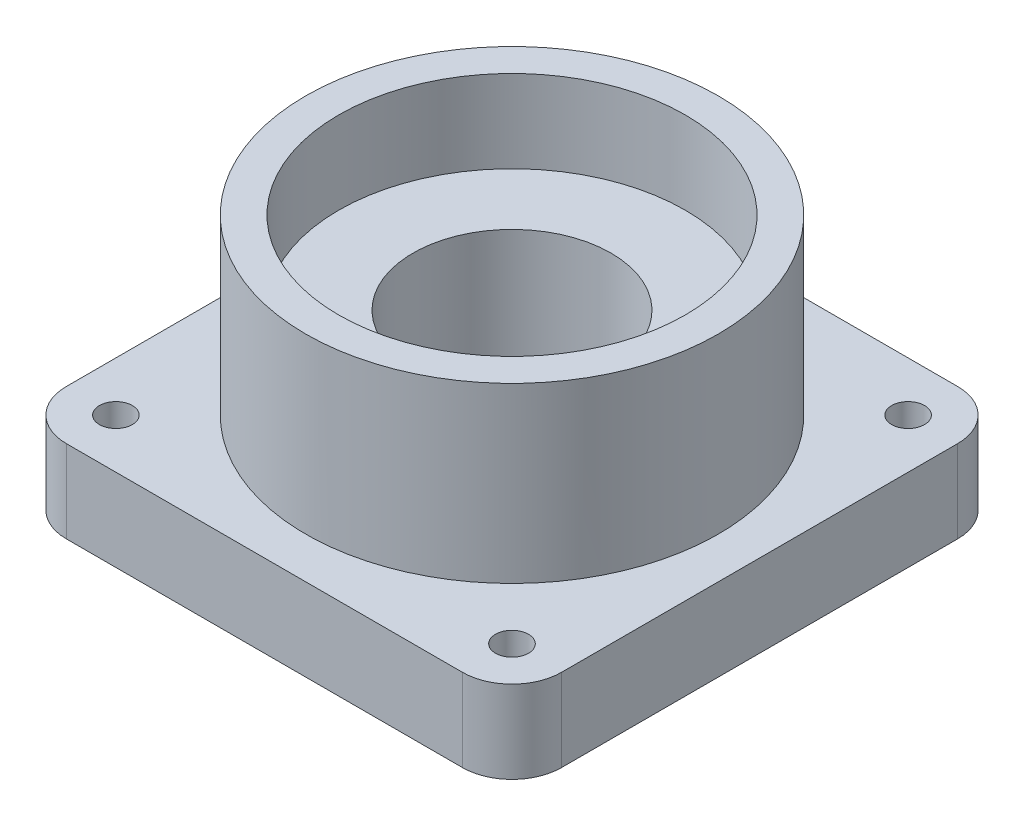
ISO-10303-21;
HEADER;
FILE_DESCRIPTION(('STEP AP214'),'2;1');
FILE_NAME('part.step','',(''),(''),'','','');
FILE_SCHEMA(('AUTOMOTIVE_DESIGN { 1 0 10303 214 1 1 1 1 }'));
ENDSEC;
DATA;
#1=APPLICATION_CONTEXT('core data for automotive mechanical design processes');
#2=APPLICATION_PROTOCOL_DEFINITION('international standard','automotive_design',2000,#1);
#3=PRODUCT_CONTEXT('',#1,'mechanical');
#4=PRODUCT('Part','Part','',(#3));
#5=PRODUCT_RELATED_PRODUCT_CATEGORY('part','',(#4));
#6=PRODUCT_DEFINITION_FORMATION('','',#4);
#7=PRODUCT_DEFINITION_CONTEXT('part definition',#1,'design');
#8=PRODUCT_DEFINITION('design','',#6,#7);
#9=PRODUCT_DEFINITION_SHAPE('','',#8);
#10=(LENGTH_UNIT() NAMED_UNIT(*) SI_UNIT(.MILLI.,.METRE.));
#11=(NAMED_UNIT(*) PLANE_ANGLE_UNIT() SI_UNIT($,.RADIAN.));
#12=(NAMED_UNIT(*) SI_UNIT($,.STERADIAN.) SOLID_ANGLE_UNIT());
#13=UNCERTAINTY_MEASURE_WITH_UNIT(LENGTH_MEASURE(1.E-05),#10,'distance_accuracy_value','');
#14=(GEOMETRIC_REPRESENTATION_CONTEXT(3) GLOBAL_UNCERTAINTY_ASSIGNED_CONTEXT((#13)) GLOBAL_UNIT_ASSIGNED_CONTEXT((#10,
#11,#12)) REPRESENTATION_CONTEXT('',''));
#15=CARTESIAN_POINT('',(0.,0.,0.));
#16=DIRECTION('',(0.,0.,1.));
#17=DIRECTION('',(1.,0.,0.));
#18=AXIS2_PLACEMENT_3D('',#15,#16,#17);
#19=CARTESIAN_POINT('',(15.,5.,15.));
#20=DIRECTION('',(-1.,0.,0.));
#21=DIRECTION('',(0.,0.,1.));
#22=AXIS2_PLACEMENT_3D('',#19,#20,#21);
#23=PLANE('',#22);
#24=DIRECTION('',(0.,0.,-1.));
#25=VECTOR('',#24,1.);
#26=CARTESIAN_POINT('',(15.,0.,15.));
#27=LINE('',#26,#25);
#28=CARTESIAN_POINT('',(15.,0.,12.));
#29=VERTEX_POINT('',#28);
#30=CARTESIAN_POINT('',(15.,0.,-12.));
#31=VERTEX_POINT('',#30);
#32=EDGE_CURVE('E135',#29,#31,#27,.T.);
#33=ORIENTED_EDGE('',*,*,#32,.T.);
#34=DIRECTION('',(0.,-1.,0.));
#35=VECTOR('',#34,1.);
#36=CARTESIAN_POINT('',(15.,5.,-12.));
#37=LINE('',#36,#35);
#38=CARTESIAN_POINT('',(15.,5.,-12.));
#39=VERTEX_POINT('',#38);
#40=EDGE_CURVE('E158',#31,#39,#37,.F.);
#41=ORIENTED_EDGE('',*,*,#40,.T.);
#42=DIRECTION('',(0.,0.,-1.));
#43=VECTOR('',#42,1.);
#44=CARTESIAN_POINT('',(15.,5.,15.));
#45=LINE('',#44,#43);
#46=CARTESIAN_POINT('',(15.,5.,12.));
#47=VERTEX_POINT('',#46);
#48=EDGE_CURVE('E133',#47,#39,#45,.T.);
#49=ORIENTED_EDGE('',*,*,#48,.F.);
#50=DIRECTION('',(0.,-1.,0.));
#51=VECTOR('',#50,1.);
#52=CARTESIAN_POINT('',(15.,5.,12.));
#53=LINE('',#52,#51);
#54=EDGE_CURVE('E155',#47,#29,#53,.T.);
#55=ORIENTED_EDGE('',*,*,#54,.T.);
#56=EDGE_LOOP('',(#33,#41,#49,#55));
#57=FACE_BOUND('',#56,.T.);
#58=ADVANCED_FACE('F38',(#57),#23,.F.);
#59=CARTESIAN_POINT('',(-15.,5.,-15.));
#60=DIRECTION('',(0.,0.,1.));
#61=DIRECTION('',(1.,0.,0.));
#62=AXIS2_PLACEMENT_3D('',#59,#60,#61);
#63=PLANE('',#62);
#64=DIRECTION('',(-1.,0.,0.));
#65=VECTOR('',#64,1.);
#66=CARTESIAN_POINT('',(-15.,0.,-15.));
#67=LINE('',#66,#65);
#68=CARTESIAN_POINT('',(12.,0.,-15.));
#69=VERTEX_POINT('',#68);
#70=CARTESIAN_POINT('',(-12.,0.,-15.));
#71=VERTEX_POINT('',#70);
#72=EDGE_CURVE('E131',#69,#71,#67,.T.);
#73=ORIENTED_EDGE('',*,*,#72,.T.);
#74=DIRECTION('',(0.,-1.,0.));
#75=VECTOR('',#74,1.);
#76=CARTESIAN_POINT('',(-12.,5.,-15.));
#77=LINE('',#76,#75);
#78=CARTESIAN_POINT('',(-12.,5.,-15.));
#79=VERTEX_POINT('',#78);
#80=EDGE_CURVE('E110',#71,#79,#77,.F.);
#81=ORIENTED_EDGE('',*,*,#80,.T.);
#82=DIRECTION('',(-1.,0.,0.));
#83=VECTOR('',#82,1.);
#84=CARTESIAN_POINT('',(-15.,5.,-15.));
#85=LINE('',#84,#83);
#86=CARTESIAN_POINT('',(12.,5.,-15.));
#87=VERTEX_POINT('',#86);
#88=EDGE_CURVE('E191',#87,#79,#85,.T.);
#89=ORIENTED_EDGE('',*,*,#88,.F.);
#90=DIRECTION('',(0.,-1.,0.));
#91=VECTOR('',#90,1.);
#92=CARTESIAN_POINT('',(12.,5.,-15.));
#93=LINE('',#92,#91);
#94=EDGE_CURVE('E115',#87,#69,#93,.T.);
#95=ORIENTED_EDGE('',*,*,#94,.T.);
#96=EDGE_LOOP('',(#73,#81,#89,#95));
#97=FACE_BOUND('',#96,.T.);
#98=ADVANCED_FACE('F255',(#97),#63,.F.);
#99=CARTESIAN_POINT('',(-15.,5.,15.));
#100=DIRECTION('',(1.,0.,0.));
#101=DIRECTION('',(0.,0.,-1.));
#102=AXIS2_PLACEMENT_3D('',#99,#100,#101);
#103=PLANE('',#102);
#104=DIRECTION('',(0.,0.,1.));
#105=VECTOR('',#104,1.);
#106=CARTESIAN_POINT('',(-15.,5.,15.));
#107=LINE('',#106,#105);
#108=CARTESIAN_POINT('',(-15.,5.,-12.));
#109=VERTEX_POINT('',#108);
#110=CARTESIAN_POINT('',(-15.,5.,12.));
#111=VERTEX_POINT('',#110);
#112=EDGE_CURVE('E124',#109,#111,#107,.T.);
#113=ORIENTED_EDGE('',*,*,#112,.F.);
#114=DIRECTION('',(0.,-1.,0.));
#115=VECTOR('',#114,1.);
#116=CARTESIAN_POINT('',(-15.,5.,-12.));
#117=LINE('',#116,#115);
#118=CARTESIAN_POINT('',(-15.,0.,-12.));
#119=VERTEX_POINT('',#118);
#120=EDGE_CURVE('E109',#109,#119,#117,.T.);
#121=ORIENTED_EDGE('',*,*,#120,.T.);
#122=DIRECTION('',(0.,0.,1.));
#123=VECTOR('',#122,1.);
#124=CARTESIAN_POINT('',(-15.,0.,15.));
#125=LINE('',#124,#123);
#126=CARTESIAN_POINT('',(-15.,0.,12.));
#127=VERTEX_POINT('',#126);
#128=EDGE_CURVE('E122',#119,#127,#125,.T.);
#129=ORIENTED_EDGE('',*,*,#128,.T.);
#130=DIRECTION('',(0.,-1.,0.));
#131=VECTOR('',#130,1.);
#132=CARTESIAN_POINT('',(-15.,5.,12.));
#133=LINE('',#132,#131);
#134=EDGE_CURVE('E126',#127,#111,#133,.F.);
#135=ORIENTED_EDGE('',*,*,#134,.T.);
#136=EDGE_LOOP('',(#113,#121,#129,#135));
#137=FACE_BOUND('',#136,.T.);
#138=ADVANCED_FACE('F121',(#137),#103,.F.);
#139=CARTESIAN_POINT('',(-15.,5.,15.));
#140=DIRECTION('',(0.,0.,-1.));
#141=DIRECTION('',(-1.,0.,0.));
#142=AXIS2_PLACEMENT_3D('',#139,#140,#141);
#143=PLANE('',#142);
#144=DIRECTION('',(1.,0.,0.));
#145=VECTOR('',#144,1.);
#146=CARTESIAN_POINT('',(-15.,0.,15.));
#147=LINE('',#146,#145);
#148=CARTESIAN_POINT('',(-12.,0.,15.));
#149=VERTEX_POINT('',#148);
#150=CARTESIAN_POINT('',(12.,0.,15.));
#151=VERTEX_POINT('',#150);
#152=EDGE_CURVE('E130',#149,#151,#147,.T.);
#153=ORIENTED_EDGE('',*,*,#152,.T.);
#154=DIRECTION('',(0.,-1.,0.));
#155=VECTOR('',#154,1.);
#156=CARTESIAN_POINT('',(12.,5.,15.));
#157=LINE('',#156,#155);
#158=CARTESIAN_POINT('',(12.,5.,15.));
#159=VERTEX_POINT('',#158);
#160=EDGE_CURVE('E53',#151,#159,#157,.F.);
#161=ORIENTED_EDGE('',*,*,#160,.T.);
#162=DIRECTION('',(1.,0.,0.));
#163=VECTOR('',#162,1.);
#164=CARTESIAN_POINT('',(-15.,5.,15.));
#165=LINE('',#164,#163);
#166=CARTESIAN_POINT('',(-12.,5.,15.));
#167=VERTEX_POINT('',#166);
#168=EDGE_CURVE('E139',#167,#159,#165,.T.);
#169=ORIENTED_EDGE('',*,*,#168,.F.);
#170=DIRECTION('',(0.,-1.,0.));
#171=VECTOR('',#170,1.);
#172=CARTESIAN_POINT('',(-12.,5.,15.));
#173=LINE('',#172,#171);
#174=EDGE_CURVE('E160',#167,#149,#173,.T.);
#175=ORIENTED_EDGE('',*,*,#174,.T.);
#176=EDGE_LOOP('',(#153,#161,#169,#175));
#177=FACE_BOUND('',#176,.T.);
#178=ADVANCED_FACE('F172',(#177),#143,.F.);
#179=CARTESIAN_POINT('',(0.,5.,0.));
#180=DIRECTION('',(0.,-1.,0.));
#181=DIRECTION('',(0.,0.,-1.));
#182=AXIS2_PLACEMENT_3D('',#179,#180,#181);
#183=PLANE('',#182);
#184=CARTESIAN_POINT('',(0.,5.,0.));
#185=DIRECTION('',(0.,-1.,0.));
#186=DIRECTION('',(0.,0.,-1.));
#187=AXIS2_PLACEMENT_3D('',#184,#185,#186);
#188=CIRCLE('',#187,12.5);
#189=CARTESIAN_POINT('',(0.,5.,-12.5));
#190=VERTEX_POINT('',#189);
#191=EDGE_CURVE('E46',#190,#190,#188,.F.);
#192=ORIENTED_EDGE('',*,*,#191,.F.);
#193=EDGE_LOOP('',(#192));
#194=FACE_BOUND('',#193,.T.);
#195=CARTESIAN_POINT('',(12.,5.,-12.));
#196=DIRECTION('',(0.,1.,0.));
#197=DIRECTION('',(0.,0.,1.));
#198=AXIS2_PLACEMENT_3D('',#195,#196,#197);
#199=CIRCLE('',#198,1.);
#200=CARTESIAN_POINT('',(12.,5.,-11.));
#201=VERTEX_POINT('',#200);
#202=EDGE_CURVE('E177',#201,#201,#199,.T.);
#203=ORIENTED_EDGE('',*,*,#202,.F.);
#204=EDGE_LOOP('',(#203));
#205=FACE_BOUND('',#204,.T.);
#206=CARTESIAN_POINT('',(-12.,5.,12.));
#207=DIRECTION('',(0.,1.,0.));
#208=DIRECTION('',(0.,0.,1.));
#209=AXIS2_PLACEMENT_3D('',#206,#207,#208);
#210=CIRCLE('',#209,1.);
#211=CARTESIAN_POINT('',(-12.,5.,13.));
#212=VERTEX_POINT('',#211);
#213=EDGE_CURVE('E181',#212,#212,#210,.T.);
#214=ORIENTED_EDGE('',*,*,#213,.F.);
#215=EDGE_LOOP('',(#214));
#216=FACE_BOUND('',#215,.T.);
#217=CARTESIAN_POINT('',(12.,5.,12.));
#218=DIRECTION('',(0.,1.,0.));
#219=DIRECTION('',(0.,0.,1.));
#220=AXIS2_PLACEMENT_3D('',#217,#218,#219);
#221=CIRCLE('',#220,0.999999999999999);
#222=CARTESIAN_POINT('',(12.,5.,13.));
#223=VERTEX_POINT('',#222);
#224=EDGE_CURVE('E185',#223,#223,#221,.T.);
#225=ORIENTED_EDGE('',*,*,#224,.F.);
#226=EDGE_LOOP('',(#225));
#227=FACE_BOUND('',#226,.T.);
#228=CARTESIAN_POINT('',(-12.,5.,-12.));
#229=DIRECTION('',(0.,1.,0.));
#230=DIRECTION('',(0.,0.,1.));
#231=AXIS2_PLACEMENT_3D('',#228,#229,#230);
#232=CIRCLE('',#231,1.);
#233=CARTESIAN_POINT('',(-12.,5.,-11.));
#234=VERTEX_POINT('',#233);
#235=EDGE_CURVE('E188',#234,#234,#232,.T.);
#236=ORIENTED_EDGE('',*,*,#235,.F.);
#237=EDGE_LOOP('',(#236));
#238=FACE_BOUND('',#237,.T.);
#239=ORIENTED_EDGE('',*,*,#88,.T.);
#240=CARTESIAN_POINT('',(-12.,5.,-12.));
#241=DIRECTION('',(0.,-1.,0.));
#242=DIRECTION('',(0.,0.,-1.));
#243=AXIS2_PLACEMENT_3D('',#240,#241,#242);
#244=CIRCLE('',#243,3.);
#245=EDGE_CURVE('E153',#79,#109,#244,.F.);
#246=ORIENTED_EDGE('',*,*,#245,.T.);
#247=ORIENTED_EDGE('',*,*,#112,.T.);
#248=CARTESIAN_POINT('',(-12.,5.,12.));
#249=DIRECTION('',(0.,-1.,0.));
#250=DIRECTION('',(0.,0.,-1.));
#251=AXIS2_PLACEMENT_3D('',#248,#249,#250);
#252=CIRCLE('',#251,3.);
#253=EDGE_CURVE('E60',#111,#167,#252,.F.);
#254=ORIENTED_EDGE('',*,*,#253,.T.);
#255=ORIENTED_EDGE('',*,*,#168,.T.);
#256=CARTESIAN_POINT('',(12.,5.,12.));
#257=DIRECTION('',(0.,-1.,0.));
#258=DIRECTION('',(0.,0.,-1.));
#259=AXIS2_PLACEMENT_3D('',#256,#257,#258);
#260=CIRCLE('',#259,3.);
#261=EDGE_CURVE('E149',#159,#47,#260,.F.);
#262=ORIENTED_EDGE('',*,*,#261,.T.);
#263=ORIENTED_EDGE('',*,*,#48,.T.);
#264=CARTESIAN_POINT('',(12.,5.,-12.));
#265=DIRECTION('',(0.,-1.,0.));
#266=DIRECTION('',(0.,0.,-1.));
#267=AXIS2_PLACEMENT_3D('',#264,#265,#266);
#268=CIRCLE('',#267,3.);
#269=EDGE_CURVE('E151',#39,#87,#268,.F.);
#270=ORIENTED_EDGE('',*,*,#269,.T.);
#271=EDGE_LOOP('',(#239,#246,#247,#254,#255,#262,#263,#270));
#272=FACE_BOUND('',#271,.T.);
#273=ADVANCED_FACE('F169',(#194,#205,#216,#227,#238,#272),#183,.F.);
#274=CARTESIAN_POINT('',(0.,0.,0.));
#275=DIRECTION('',(0.,-1.,0.));
#276=DIRECTION('',(0.,0.,-1.));
#277=AXIS2_PLACEMENT_3D('',#274,#275,#276);
#278=PLANE('',#277);
#279=CARTESIAN_POINT('',(0.,0.,0.));
#280=DIRECTION('',(0.,-1.,0.));
#281=DIRECTION('',(0.,0.,-1.));
#282=AXIS2_PLACEMENT_3D('',#279,#280,#281);
#283=CIRCLE('',#282,6.);
#284=CARTESIAN_POINT('',(0.,0.,-6.));
#285=VERTEX_POINT('',#284);
#286=EDGE_CURVE('E229',#285,#285,#283,.F.);
#287=ORIENTED_EDGE('',*,*,#286,.T.);
#288=EDGE_LOOP('',(#287));
#289=FACE_BOUND('',#288,.T.);
#290=CARTESIAN_POINT('',(12.,0.,-12.));
#291=DIRECTION('',(0.,-1.,0.));
#292=DIRECTION('',(0.,0.,-1.));
#293=AXIS2_PLACEMENT_3D('',#290,#291,#292);
#294=CIRCLE('',#293,1.);
#295=CARTESIAN_POINT('',(12.,0.,-13.));
#296=VERTEX_POINT('',#295);
#297=EDGE_CURVE('E209',#296,#296,#294,.F.);
#298=ORIENTED_EDGE('',*,*,#297,.T.);
#299=EDGE_LOOP('',(#298));
#300=FACE_BOUND('',#299,.T.);
#301=CARTESIAN_POINT('',(-12.,0.,12.));
#302=DIRECTION('',(0.,-1.,0.));
#303=DIRECTION('',(0.,0.,-1.));
#304=AXIS2_PLACEMENT_3D('',#301,#302,#303);
#305=CIRCLE('',#304,1.);
#306=CARTESIAN_POINT('',(-12.,0.,11.));
#307=VERTEX_POINT('',#306);
#308=EDGE_CURVE('E212',#307,#307,#305,.F.);
#309=ORIENTED_EDGE('',*,*,#308,.T.);
#310=EDGE_LOOP('',(#309));
#311=FACE_BOUND('',#310,.T.);
#312=CARTESIAN_POINT('',(12.,0.,12.));
#313=DIRECTION('',(0.,-1.,0.));
#314=DIRECTION('',(0.,0.,-1.));
#315=AXIS2_PLACEMENT_3D('',#312,#313,#314);
#316=CIRCLE('',#315,0.999999999999999);
#317=CARTESIAN_POINT('',(12.,0.,11.));
#318=VERTEX_POINT('',#317);
#319=EDGE_CURVE('E213',#318,#318,#316,.F.);
#320=ORIENTED_EDGE('',*,*,#319,.T.);
#321=EDGE_LOOP('',(#320));
#322=FACE_BOUND('',#321,.T.);
#323=CARTESIAN_POINT('',(-12.,0.,-12.));
#324=DIRECTION('',(0.,-1.,0.));
#325=DIRECTION('',(0.,0.,-1.));
#326=AXIS2_PLACEMENT_3D('',#323,#324,#325);
#327=CIRCLE('',#326,1.);
#328=CARTESIAN_POINT('',(-12.,0.,-13.));
#329=VERTEX_POINT('',#328);
#330=EDGE_CURVE('E205',#329,#329,#327,.F.);
#331=ORIENTED_EDGE('',*,*,#330,.T.);
#332=EDGE_LOOP('',(#331));
#333=FACE_BOUND('',#332,.T.);
#334=ORIENTED_EDGE('',*,*,#128,.F.);
#335=CARTESIAN_POINT('',(-12.,0.,-12.));
#336=DIRECTION('',(0.,-1.,0.));
#337=DIRECTION('',(0.,0.,-1.));
#338=AXIS2_PLACEMENT_3D('',#335,#336,#337);
#339=CIRCLE('',#338,3.);
#340=EDGE_CURVE('E105',#119,#71,#339,.T.);
#341=ORIENTED_EDGE('',*,*,#340,.T.);
#342=ORIENTED_EDGE('',*,*,#72,.F.);
#343=CARTESIAN_POINT('',(12.,0.,-12.));
#344=DIRECTION('',(0.,-1.,0.));
#345=DIRECTION('',(0.,0.,-1.));
#346=AXIS2_PLACEMENT_3D('',#343,#344,#345);
#347=CIRCLE('',#346,3.);
#348=EDGE_CURVE('E116',#69,#31,#347,.T.);
#349=ORIENTED_EDGE('',*,*,#348,.T.);
#350=ORIENTED_EDGE('',*,*,#32,.F.);
#351=CARTESIAN_POINT('',(12.,0.,12.));
#352=DIRECTION('',(0.,-1.,0.));
#353=DIRECTION('',(0.,0.,-1.));
#354=AXIS2_PLACEMENT_3D('',#351,#352,#353);
#355=CIRCLE('',#354,3.);
#356=EDGE_CURVE('E142',#29,#151,#355,.T.);
#357=ORIENTED_EDGE('',*,*,#356,.T.);
#358=ORIENTED_EDGE('',*,*,#152,.F.);
#359=CARTESIAN_POINT('',(-12.,0.,12.));
#360=DIRECTION('',(0.,-1.,0.));
#361=DIRECTION('',(0.,0.,-1.));
#362=AXIS2_PLACEMENT_3D('',#359,#360,#361);
#363=CIRCLE('',#362,3.);
#364=EDGE_CURVE('E125',#149,#127,#363,.T.);
#365=ORIENTED_EDGE('',*,*,#364,.T.);
#366=EDGE_LOOP('',(#334,#341,#342,#349,#350,#357,#358,#365));
#367=FACE_BOUND('',#366,.T.);
#368=ADVANCED_FACE('F128',(#289,#300,#311,#322,#333,#367),#278,.T.);
#369=CARTESIAN_POINT('',(-12.,-0.00100000000000013,-12.));
#370=DIRECTION('',(0.,1.,0.));
#371=DIRECTION('',(0.,0.,1.));
#372=AXIS2_PLACEMENT_3D('',#369,#370,#371);
#373=CYLINDRICAL_SURFACE('',#372,1.);
#374=ORIENTED_EDGE('',*,*,#330,.F.);
#375=EDGE_LOOP('',(#374));
#376=FACE_BOUND('',#375,.T.);
#377=ORIENTED_EDGE('',*,*,#235,.T.);
#378=EDGE_LOOP('',(#377));
#379=FACE_BOUND('',#378,.T.);
#380=ADVANCED_FACE('F287',(#376,#379),#373,.F.);
#381=CARTESIAN_POINT('',(12.,-0.00100000000000013,12.));
#382=DIRECTION('',(0.,1.,0.));
#383=DIRECTION('',(0.,0.,1.));
#384=AXIS2_PLACEMENT_3D('',#381,#382,#383);
#385=CYLINDRICAL_SURFACE('',#384,0.999999999999999);
#386=ORIENTED_EDGE('',*,*,#319,.F.);
#387=EDGE_LOOP('',(#386));
#388=FACE_BOUND('',#387,.T.);
#389=ORIENTED_EDGE('',*,*,#224,.T.);
#390=EDGE_LOOP('',(#389));
#391=FACE_BOUND('',#390,.T.);
#392=ADVANCED_FACE('F292',(#388,#391),#385,.F.);
#393=CARTESIAN_POINT('',(-12.,-0.00100000000000013,12.));
#394=DIRECTION('',(0.,1.,0.));
#395=DIRECTION('',(0.,0.,1.));
#396=AXIS2_PLACEMENT_3D('',#393,#394,#395);
#397=CYLINDRICAL_SURFACE('',#396,1.);
#398=ORIENTED_EDGE('',*,*,#308,.F.);
#399=EDGE_LOOP('',(#398));
#400=FACE_BOUND('',#399,.T.);
#401=ORIENTED_EDGE('',*,*,#213,.T.);
#402=EDGE_LOOP('',(#401));
#403=FACE_BOUND('',#402,.T.);
#404=ADVANCED_FACE('F294',(#400,#403),#397,.F.);
#405=CARTESIAN_POINT('',(12.,-0.00100000000000013,-12.));
#406=DIRECTION('',(0.,1.,0.));
#407=DIRECTION('',(0.,0.,1.));
#408=AXIS2_PLACEMENT_3D('',#405,#406,#407);
#409=CYLINDRICAL_SURFACE('',#408,1.);
#410=ORIENTED_EDGE('',*,*,#297,.F.);
#411=EDGE_LOOP('',(#410));
#412=FACE_BOUND('',#411,.T.);
#413=ORIENTED_EDGE('',*,*,#202,.T.);
#414=EDGE_LOOP('',(#413));
#415=FACE_BOUND('',#414,.T.);
#416=ADVANCED_FACE('F266',(#412,#415),#409,.F.);
#417=CARTESIAN_POINT('',(-12.,5.,-12.));
#418=DIRECTION('',(0.,-1.,0.));
#419=DIRECTION('',(0.,0.,-1.));
#420=AXIS2_PLACEMENT_3D('',#417,#418,#419);
#421=CYLINDRICAL_SURFACE('',#420,3.);
#422=ORIENTED_EDGE('',*,*,#245,.F.);
#423=ORIENTED_EDGE('',*,*,#80,.F.);
#424=ORIENTED_EDGE('',*,*,#340,.F.);
#425=ORIENTED_EDGE('',*,*,#120,.F.);
#426=EDGE_LOOP('',(#422,#423,#424,#425));
#427=FACE_BOUND('',#426,.T.);
#428=ADVANCED_FACE('F108',(#427),#421,.T.);
#429=CARTESIAN_POINT('',(12.,5.,-12.));
#430=DIRECTION('',(0.,-1.,0.));
#431=DIRECTION('',(0.,0.,-1.));
#432=AXIS2_PLACEMENT_3D('',#429,#430,#431);
#433=CYLINDRICAL_SURFACE('',#432,3.);
#434=ORIENTED_EDGE('',*,*,#269,.F.);
#435=ORIENTED_EDGE('',*,*,#40,.F.);
#436=ORIENTED_EDGE('',*,*,#348,.F.);
#437=ORIENTED_EDGE('',*,*,#94,.F.);
#438=EDGE_LOOP('',(#434,#435,#436,#437));
#439=FACE_BOUND('',#438,.T.);
#440=ADVANCED_FACE('F265',(#439),#433,.T.);
#441=CARTESIAN_POINT('',(12.,5.,12.));
#442=DIRECTION('',(0.,-1.,0.));
#443=DIRECTION('',(0.,0.,-1.));
#444=AXIS2_PLACEMENT_3D('',#441,#442,#443);
#445=CYLINDRICAL_SURFACE('',#444,3.);
#446=ORIENTED_EDGE('',*,*,#261,.F.);
#447=ORIENTED_EDGE('',*,*,#160,.F.);
#448=ORIENTED_EDGE('',*,*,#356,.F.);
#449=ORIENTED_EDGE('',*,*,#54,.F.);
#450=EDGE_LOOP('',(#446,#447,#448,#449));
#451=FACE_BOUND('',#450,.T.);
#452=ADVANCED_FACE('F268',(#451),#445,.T.);
#453=CARTESIAN_POINT('',(-12.,5.,12.));
#454=DIRECTION('',(0.,-1.,0.));
#455=DIRECTION('',(0.,0.,-1.));
#456=AXIS2_PLACEMENT_3D('',#453,#454,#455);
#457=CYLINDRICAL_SURFACE('',#456,3.);
#458=ORIENTED_EDGE('',*,*,#253,.F.);
#459=ORIENTED_EDGE('',*,*,#134,.F.);
#460=ORIENTED_EDGE('',*,*,#364,.F.);
#461=ORIENTED_EDGE('',*,*,#174,.F.);
#462=EDGE_LOOP('',(#458,#459,#460,#461));
#463=FACE_BOUND('',#462,.T.);
#464=ADVANCED_FACE('F40',(#463),#457,.T.);
#465=CARTESIAN_POINT('',(0.,10.5,0.));
#466=DIRECTION('',(0.,-1.,0.));
#467=DIRECTION('',(0.,0.,-1.));
#468=AXIS2_PLACEMENT_3D('',#465,#466,#467);
#469=CYLINDRICAL_SURFACE('',#468,12.5);
#470=ORIENTED_EDGE('',*,*,#191,.T.);
#471=EDGE_LOOP('',(#470));
#472=FACE_BOUND('',#471,.T.);
#473=CARTESIAN_POINT('',(0.,15.5,0.));
#474=DIRECTION('',(0.,1.,0.));
#475=DIRECTION('',(0.,0.,1.));
#476=AXIS2_PLACEMENT_3D('',#473,#474,#475);
#477=CIRCLE('',#476,12.5);
#478=CARTESIAN_POINT('',(0.,15.5,12.5));
#479=VERTEX_POINT('',#478);
#480=EDGE_CURVE('E220',#479,#479,#477,.T.);
#481=ORIENTED_EDGE('',*,*,#480,.F.);
#482=EDGE_LOOP('',(#481));
#483=FACE_BOUND('',#482,.T.);
#484=ADVANCED_FACE('F166',(#472,#483),#469,.T.);
#485=CARTESIAN_POINT('',(0.,15.5,0.));
#486=DIRECTION('',(0.,1.,0.));
#487=DIRECTION('',(0.,0.,1.));
#488=AXIS2_PLACEMENT_3D('',#485,#486,#487);
#489=PLANE('',#488);
#490=ORIENTED_EDGE('',*,*,#480,.T.);
#491=EDGE_LOOP('',(#490));
#492=FACE_BOUND('',#491,.T.);
#493=CARTESIAN_POINT('',(0.,15.5,0.));
#494=DIRECTION('',(0.,1.,0.));
#495=DIRECTION('',(0.,0.,1.));
#496=AXIS2_PLACEMENT_3D('',#493,#494,#495);
#497=CIRCLE('',#496,10.5);
#498=CARTESIAN_POINT('',(0.,15.5,10.5));
#499=VERTEX_POINT('',#498);
#500=EDGE_CURVE('E225',#499,#499,#497,.T.);
#501=ORIENTED_EDGE('',*,*,#500,.F.);
#502=EDGE_LOOP('',(#501));
#503=FACE_BOUND('',#502,.T.);
#504=ADVANCED_FACE('F245',(#492,#503),#489,.T.);
#505=CARTESIAN_POINT('',(0.,15.5,0.));
#506=DIRECTION('',(0.,-1.,0.));
#507=DIRECTION('',(0.,0.,-1.));
#508=AXIS2_PLACEMENT_3D('',#505,#506,#507);
#509=CYLINDRICAL_SURFACE('',#508,10.5);
#510=ORIENTED_EDGE('',*,*,#500,.T.);
#511=EDGE_LOOP('',(#510));
#512=FACE_BOUND('',#511,.T.);
#513=CARTESIAN_POINT('',(0.,10.5,0.));
#514=DIRECTION('',(0.,1.,0.));
#515=DIRECTION('',(0.,0.,1.));
#516=AXIS2_PLACEMENT_3D('',#513,#514,#515);
#517=CIRCLE('',#516,10.5);
#518=CARTESIAN_POINT('',(0.,10.5,10.5));
#519=VERTEX_POINT('',#518);
#520=EDGE_CURVE('E11',#519,#519,#517,.F.);
#521=ORIENTED_EDGE('',*,*,#520,.T.);
#522=EDGE_LOOP('',(#521));
#523=FACE_BOUND('',#522,.T.);
#524=ADVANCED_FACE('F240',(#512,#523),#509,.F.);
#525=CARTESIAN_POINT('',(0.,10.5,0.));
#526=DIRECTION('',(0.,1.,0.));
#527=DIRECTION('',(0.,0.,1.));
#528=AXIS2_PLACEMENT_3D('',#525,#526,#527);
#529=PLANE('',#528);
#530=CARTESIAN_POINT('',(0.,10.5,0.));
#531=DIRECTION('',(0.,1.,0.));
#532=DIRECTION('',(0.,0.,1.));
#533=AXIS2_PLACEMENT_3D('',#530,#531,#532);
#534=CIRCLE('',#533,6.);
#535=CARTESIAN_POINT('',(0.,10.5,6.));
#536=VERTEX_POINT('',#535);
#537=EDGE_CURVE('E228',#536,#536,#534,.T.);
#538=ORIENTED_EDGE('',*,*,#537,.F.);
#539=EDGE_LOOP('',(#538));
#540=FACE_BOUND('',#539,.T.);
#541=ORIENTED_EDGE('',*,*,#520,.F.);
#542=EDGE_LOOP('',(#541));
#543=FACE_BOUND('',#542,.T.);
#544=ADVANCED_FACE('F237',(#540,#543),#529,.T.);
#545=CARTESIAN_POINT('',(0.,-0.000999999999999265,0.));
#546=DIRECTION('',(0.,1.,0.));
#547=DIRECTION('',(0.,0.,1.));
#548=AXIS2_PLACEMENT_3D('',#545,#546,#547);
#549=CYLINDRICAL_SURFACE('',#548,6.);
#550=ORIENTED_EDGE('',*,*,#286,.F.);
#551=EDGE_LOOP('',(#550));
#552=FACE_BOUND('',#551,.T.);
#553=ORIENTED_EDGE('',*,*,#537,.T.);
#554=EDGE_LOOP('',(#553));
#555=FACE_BOUND('',#554,.T.);
#556=ADVANCED_FACE('F235',(#552,#555),#549,.F.);
#557=CLOSED_SHELL('',(#58,#98,#138,#178,#273,#368,#380,#392,#404,#416,#428,#440,#452,#464,#484,
#504,#524,#544,#556));
#558=MANIFOLD_SOLID_BREP('B2',#557);
#559=ADVANCED_BREP_SHAPE_REPRESENTATION('',(#18,#558),#14);
#560=SHAPE_DEFINITION_REPRESENTATION(#9,#559);
ENDSEC;
END-ISO-10303-21;
